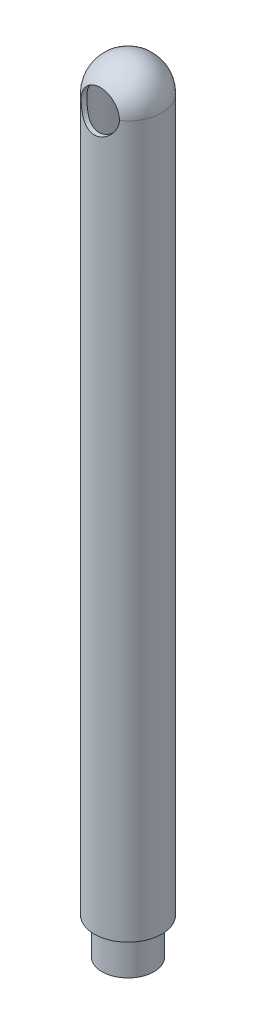
ISO-10303-21;
HEADER;
FILE_DESCRIPTION(('STEP AP214'),'2;1');
FILE_NAME('part.step','',(''),(''),'','','');
FILE_SCHEMA(('AUTOMOTIVE_DESIGN { 1 0 10303 214 1 1 1 1 }'));
ENDSEC;
DATA;
#1=APPLICATION_CONTEXT('core data for automotive mechanical design processes');
#2=APPLICATION_PROTOCOL_DEFINITION('international standard','automotive_design',2000,#1);
#3=PRODUCT_CONTEXT('',#1,'mechanical');
#4=PRODUCT('Part','Part','',(#3));
#5=PRODUCT_RELATED_PRODUCT_CATEGORY('part','',(#4));
#6=PRODUCT_DEFINITION_FORMATION('','',#4);
#7=PRODUCT_DEFINITION_CONTEXT('part definition',#1,'design');
#8=PRODUCT_DEFINITION('design','',#6,#7);
#9=PRODUCT_DEFINITION_SHAPE('','',#8);
#10=(LENGTH_UNIT() NAMED_UNIT(*) SI_UNIT(.MILLI.,.METRE.));
#11=(NAMED_UNIT(*) PLANE_ANGLE_UNIT() SI_UNIT($,.RADIAN.));
#12=(NAMED_UNIT(*) SI_UNIT($,.STERADIAN.) SOLID_ANGLE_UNIT());
#13=UNCERTAINTY_MEASURE_WITH_UNIT(LENGTH_MEASURE(1.E-05),#10,'distance_accuracy_value','');
#14=(GEOMETRIC_REPRESENTATION_CONTEXT(3) GLOBAL_UNCERTAINTY_ASSIGNED_CONTEXT((#13)) GLOBAL_UNIT_ASSIGNED_CONTEXT((#10,
#11,#12)) REPRESENTATION_CONTEXT('',''));
#15=CARTESIAN_POINT('',(0.,0.,0.));
#16=DIRECTION('',(0.,0.,1.));
#17=DIRECTION('',(1.,0.,0.));
#18=AXIS2_PLACEMENT_3D('',#15,#16,#17);
#19=CARTESIAN_POINT('',(0.,821.,0.));
#20=DIRECTION('',(0.,-1.,0.));
#21=DIRECTION('',(1.,0.,0.));
#22=AXIS2_PLACEMENT_3D('',#19,#20,#21);
#23=SPHERICAL_SURFACE('',#22,32.);
#24=CARTESIAN_POINT('',(0.,821.,0.));
#25=DIRECTION('',(0.,-1.,0.));
#26=DIRECTION('',(0.,0.,-1.));
#27=AXIS2_PLACEMENT_3D('',#24,#25,#26);
#28=CIRCLE('',#27,32.);
#29=CARTESIAN_POINT('',(21.,821.,-24.1453929352993));
#30=VERTEX_POINT('',#29);
#31=CARTESIAN_POINT('',(21.,821.,24.1453929352993));
#32=VERTEX_POINT('',#31);
#33=EDGE_CURVE('E79',#30,#32,#28,.T.);
#34=ORIENTED_EDGE('',*,*,#33,.T.);
#35=CARTESIAN_POINT('',(0.,821.,24.1453929352993));
#36=DIRECTION('',(0.,0.,-1.));
#37=DIRECTION('',(-1.,0.,0.));
#38=AXIS2_PLACEMENT_3D('',#35,#36,#37);
#39=CIRCLE('',#38,21.);
#40=CARTESIAN_POINT('',(-21.,821.,24.1453929352993));
#41=VERTEX_POINT('',#40);
#42=EDGE_CURVE('E54',#32,#41,#39,.F.);
#43=ORIENTED_EDGE('',*,*,#42,.T.);
#44=CARTESIAN_POINT('',(-21.,821.,-24.1453929352993));
#45=VERTEX_POINT('',#44);
#46=EDGE_CURVE('E113',#41,#45,#28,.T.);
#47=ORIENTED_EDGE('',*,*,#46,.T.);
#48=CARTESIAN_POINT('',(0.,821.,-24.1453929352993));
#49=DIRECTION('',(0.,0.,1.));
#50=DIRECTION('',(1.,0.,0.));
#51=AXIS2_PLACEMENT_3D('',#48,#49,#50);
#52=CIRCLE('',#51,21.);
#53=EDGE_CURVE('E47',#45,#30,#52,.F.);
#54=ORIENTED_EDGE('',*,*,#53,.T.);
#55=EDGE_LOOP('',(#34,#43,#47,#54));
#56=FACE_BOUND('',#55,.T.);
#57=ADVANCED_FACE('F34',(#56),#23,.F.);
#58=CARTESIAN_POINT('',(0.,0.,0.));
#59=DIRECTION('',(0.,-1.,0.));
#60=DIRECTION('',(0.,0.,-1.));
#61=AXIS2_PLACEMENT_3D('',#58,#59,#60);
#62=CYLINDRICAL_SURFACE('',#61,32.);
#63=ORIENTED_EDGE('',*,*,#33,.F.);
#64=CARTESIAN_POINT('',(21.,821.,-24.1453929352993));
#65=CARTESIAN_POINT('',(21.0000088316979,820.740691037745,-24.1453747677393));
#66=CARTESIAN_POINT('',(20.9951972765071,820.481389489406,-24.1495697541191));
#67=CARTESIAN_POINT('',(20.9760002226579,819.963431901864,-24.1662514695807));
#68=CARTESIAN_POINT('',(20.9616156272982,819.704775804069,-24.1787374163389));
#69=CARTESIAN_POINT('',(20.9233631858055,819.189012695056,-24.2118458608544));
#70=CARTESIAN_POINT('',(20.8995071977962,818.931904153378,-24.2324581842149));
#71=CARTESIAN_POINT('',(20.8424448952335,818.41950084767,-24.2815545901595));
#72=CARTESIAN_POINT('',(20.8092384326426,818.164206112423,-24.3100387973717));
#73=CARTESIAN_POINT('',(20.6965472767031,817.406718763127,-24.4062037181729));
#74=CARTESIAN_POINT('',(20.603607348189,816.907831391839,-24.484935518309));
#75=CARTESIAN_POINT('',(20.383230871151,815.922703361117,-24.6686919441093));
#76=CARTESIAN_POINT('',(20.255784861515,815.436466210343,-24.7737237803018));
#77=CARTESIAN_POINT('',(19.9689375471104,814.481658382307,-25.0055059082618));
#78=CARTESIAN_POINT('',(19.8096982360571,814.013011902402,-25.1321456458305));
#79=CARTESIAN_POINT('',(19.4606530644217,813.092710379754,-25.4033815484109));
#80=CARTESIAN_POINT('',(19.2708486384692,812.641054540749,-25.5479768705714));
#81=CARTESIAN_POINT('',(18.8617380553961,811.754802944317,-25.8514962040515));
#82=CARTESIAN_POINT('',(18.6423570553214,811.320254202796,-26.0104562170485));
#83=CARTESIAN_POINT('',(18.1758299736148,810.470314733638,-26.3385753299218));
#84=CARTESIAN_POINT('',(17.9286803038417,810.054926491637,-26.5077357465364));
#85=CARTESIAN_POINT('',(17.3689891030261,809.183709731309,-26.8783737219659));
#86=CARTESIAN_POINT('',(17.052189822581,808.731064150408,-27.0809139321511));
#87=CARTESIAN_POINT('',(16.3848883436248,807.853157212833,-27.4897906969876));
#88=CARTESIAN_POINT('',(16.0343839514127,807.427897641593,-27.6961274980328));
#89=CARTESIAN_POINT('',(15.3007230709074,806.605853630457,-28.1080933809534));
#90=CARTESIAN_POINT('',(14.9175553028036,806.209079115301,-28.3137221926224));
#91=CARTESIAN_POINT('',(14.1197500789186,805.445659373694,-28.7199073269651));
#92=CARTESIAN_POINT('',(13.705110563228,805.079016122691,-28.9204633164618));
#93=CARTESIAN_POINT('',(12.7858306114702,804.329022586695,-29.3395942097164));
#94=CARTESIAN_POINT('',(12.2766837938949,803.950408540102,-29.5568100432697));
#95=CARTESIAN_POINT('',(11.2210442373302,803.237858130975,-29.9734912945481));
#96=CARTESIAN_POINT('',(10.674547176352,802.903926952195,-30.1729546518739));
#97=CARTESIAN_POINT('',(9.54741372521576,802.284766391966,-30.5483126085786));
#98=CARTESIAN_POINT('',(8.96680261086222,801.999501549402,-30.7242243487406));
#99=CARTESIAN_POINT('',(7.77493832830593,801.481488722635,-31.0472424497318));
#100=CARTESIAN_POINT('',(7.16369149881967,801.248729928985,-31.1943547386924));
#101=CARTESIAN_POINT('',(5.98400123885728,800.862132043321,-31.4406436445466));
#102=CARTESIAN_POINT('',(5.41820120544405,800.702441660689,-31.5433055403064));
#103=CARTESIAN_POINT('',(4.27079361705985,800.430415310377,-31.7190322235755));
#104=CARTESIAN_POINT('',(3.68918710819908,800.31807621696,-31.7920989646969));
#105=CARTESIAN_POINT('',(2.51606531754383,800.142847689961,-31.9063691696717));
#106=CARTESIAN_POINT('',(1.92456061227867,800.079908536209,-31.9476046704178));
#107=CARTESIAN_POINT('',(0.736995310789576,800.004508202843,-31.9970285689199));
#108=CARTESIAN_POINT('',(0.140935336372701,799.992040252855,-32.0052213991287));
#109=CARTESIAN_POINT('',(-0.961567175425794,800.01588625848,-31.9895769030265));
#110=CARTESIAN_POINT('',(-1.46824295696806,800.045267102885,-31.9702917121716));
#111=CARTESIAN_POINT('',(-2.47664429448449,800.140406828278,-31.9080134046263));
#112=CARTESIAN_POINT('',(-2.97837046012767,800.206161170547,-31.8650232458663));
#113=CARTESIAN_POINT('',(-3.97337860741311,800.373153357857,-31.756303248893));
#114=CARTESIAN_POINT('',(-4.46666012877832,800.474393130621,-31.6905721752968));
#115=CARTESIAN_POINT('',(-5.4415741460432,800.711064196975,-31.5377987791912));
#116=CARTESIAN_POINT('',(-5.92320613966885,800.84649696194,-31.4507555395927));
#117=CARTESIAN_POINT('',(-6.87094197136686,801.149631034804,-31.257376111375));
#118=CARTESIAN_POINT('',(-7.33707852742383,801.317258516305,-31.1510840937894));
#119=CARTESIAN_POINT('',(-8.25265227363691,801.683250544071,-30.9211342776345));
#120=CARTESIAN_POINT('',(-8.70208973558278,801.881614589803,-30.7974767618578));
#121=CARTESIAN_POINT('',(-9.58238329813768,802.307301771889,-30.5350435362887));
#122=CARTESIAN_POINT('',(-10.013240417395,802.534623317969,-30.3962686567649));
#123=CARTESIAN_POINT('',(-10.8549575374055,803.016531513341,-30.1059487747669));
#124=CARTESIAN_POINT('',(-11.2658152203512,803.271121311959,-29.9544022976782));
#125=CARTESIAN_POINT('',(-12.1182215278016,803.840618256934,-29.6206757017217));
#126=CARTESIAN_POINT('',(-12.5568486936885,804.159066537129,-29.4370706534333));
#127=CARTESIAN_POINT('',(-13.405734382334,804.826629289831,-29.0603162969956));
#128=CARTESIAN_POINT('',(-13.8159908807211,805.175745946634,-28.8671663094557));
#129=CARTESIAN_POINT('',(-14.6077999759704,805.903579506988,-28.4746867647341));
#130=CARTESIAN_POINT('',(-14.9892960107424,806.282351898377,-28.2753460659012));
#131=CARTESIAN_POINT('',(-15.7217174653375,807.06745349012,-27.874753233038));
#132=CARTESIAN_POINT('',(-16.0726409813813,807.473784403772,-27.6735009808377));
#133=CARTESIAN_POINT('',(-16.7933004623472,808.375949408215,-27.2431023121571));
#134=CARTESIAN_POINT('',(-17.1579263128651,808.876052917794,-27.014313558808));
#135=CARTESIAN_POINT('',(-17.843462775851,809.909667815585,-26.5664923504611));
#136=CARTESIAN_POINT('',(-18.1643662674575,810.443184625065,-26.3474614885868));
#137=CARTESIAN_POINT('',(-18.7588133044343,811.53985215885,-25.9275689968921));
#138=CARTESIAN_POINT('',(-19.0325378015737,812.102878345072,-25.7266394243189));
#139=CARTESIAN_POINT('',(-19.5310833971079,813.258398140622,-25.350235188121));
#140=CARTESIAN_POINT('',(-19.755915286797,813.850885211971,-25.1747549103287));
#141=CARTESIAN_POINT('',(-20.1230748987986,814.970519282704,-24.881888996788));
#142=CARTESIAN_POINT('',(-20.2727352808587,815.494016151922,-24.7597318742219));
#143=CARTESIAN_POINT('',(-20.5318473985312,816.556811381714,-24.5452986216119));
#144=CARTESIAN_POINT('',(-20.6413188295875,817.096101861999,-24.4530078575638));
#145=CARTESIAN_POINT('',(-20.7742853301892,817.916631418739,-24.3399343722897));
#146=CARTESIAN_POINT('',(-20.8135326807269,818.193678818179,-24.3063534449985));
#147=CARTESIAN_POINT('',(-20.8810059901811,818.750092842199,-24.2484140350027));
#148=CARTESIAN_POINT('',(-20.9092322123994,819.029459411211,-24.2240553319738));
#149=CARTESIAN_POINT('',(-20.954519885941,819.590265390923,-24.1848928121051));
#150=CARTESIAN_POINT('',(-20.9715613336249,819.87170761005,-24.1701061151591));
#151=CARTESIAN_POINT('',(-20.9943083173097,820.43542958441,-24.150342811806));
#152=CARTESIAN_POINT('',(-21.0000123483377,820.717709445855,-24.1453675078022));
#153=CARTESIAN_POINT('',(-21.,821.,-24.1453929352993));
#154=B_SPLINE_CURVE_WITH_KNOTS('',3,(#64,#65,#66,#67,#68,#69,#70,#71,#72,#73,#74,#75,#76,#77,
#78,#79,#80,#81,#82,#83,#84,#85,#86,#87,#88,#89,#90,#91,#92,#93,#94,#95,#96,#97,#98,#99,#100,
#101,#102,#103,#104,#105,#106,#107,#108,#109,#110,#111,#112,#113,#114,#115,#116,#117,#118,#119,
#120,#121,#122,#123,#124,#125,#126,#127,#128,#129,#130,#131,#132,#133,#134,#135,#136,#137,#138,
#139,#140,#141,#142,#143,#144,#145,#146,#147,#148,#149,#150,#151,#152,#153),.UNSPECIFIED.,.F.,
.F.,(4,2,2,2,2,2,2,2,2,2,2,2,2,2,2,2,2,2,2,2,2,2,2,2,2,2,2,2,2,2,2,2,2,2,2,2,2,2,2,2,2,2,2,2,4),
(0.,0.777835610910544,1.55559783675146,2.33238936445954,3.10919319107683,4.64751016167806,
6.18624934637903,7.71733970660556,9.24835822323328,10.7833263329427,12.3184930128536,
14.0821507442629,15.8459233413221,17.6103075177792,19.374807277617,21.3840459526791,
23.3935175220248,25.401518561387,27.4091058345459,29.1968321670981,30.9844404704112,
32.7702472619219,34.5558144914494,36.0776528197473,37.5993012944336,39.1210324444981,
40.6428290880737,42.1611768561701,43.6794999012305,45.197739599682,46.7161548355704,
48.4313200899513,50.1466076028915,51.8651849685514,53.5838692752517,55.5610746202655,
57.5386015997574,59.5083664463177,61.4776960954902,63.1495324713512,64.8205484313183,
65.6657008846277,66.5108331454722,67.3574728112179,68.2042248557166),.UNSPECIFIED.);
#155=EDGE_CURVE('E123',#30,#45,#154,.T.);
#156=ORIENTED_EDGE('',*,*,#155,.T.);
#157=ORIENTED_EDGE('',*,*,#46,.F.);
#158=CARTESIAN_POINT('',(-21.,821.,24.1453929352993));
#159=CARTESIAN_POINT('',(-21.0000088316979,820.740691037745,24.1453747677393));
#160=CARTESIAN_POINT('',(-20.9951972765071,820.481389489406,24.1495697541191));
#161=CARTESIAN_POINT('',(-20.9760002226579,819.963431901864,24.1662514695807));
#162=CARTESIAN_POINT('',(-20.9616156272982,819.704775804069,24.1787374163389));
#163=CARTESIAN_POINT('',(-20.9233631858055,819.189012695056,24.2118458608544));
#164=CARTESIAN_POINT('',(-20.8995071977962,818.931904153378,24.2324581842149));
#165=CARTESIAN_POINT('',(-20.8424448952335,818.41950084767,24.2815545901595));
#166=CARTESIAN_POINT('',(-20.8092384326426,818.164206112423,24.3100387973717));
#167=CARTESIAN_POINT('',(-20.6965472767031,817.406718763127,24.4062037181729));
#168=CARTESIAN_POINT('',(-20.603607348189,816.907831391839,24.484935518309));
#169=CARTESIAN_POINT('',(-20.383230871151,815.922703361117,24.6686919441093));
#170=CARTESIAN_POINT('',(-20.255784861515,815.436466210343,24.7737237803018));
#171=CARTESIAN_POINT('',(-19.9689375471104,814.481658382307,25.0055059082618));
#172=CARTESIAN_POINT('',(-19.8096982360572,814.013011902402,25.1321456458305));
#173=CARTESIAN_POINT('',(-19.4606530644217,813.092710379754,25.4033815484109));
#174=CARTESIAN_POINT('',(-19.2708486384692,812.641054540749,25.5479768705714));
#175=CARTESIAN_POINT('',(-18.8617380553961,811.754802944317,25.8514962040515));
#176=CARTESIAN_POINT('',(-18.6423570553214,811.320254202796,26.0104562170485));
#177=CARTESIAN_POINT('',(-18.1758299736149,810.470314733638,26.3385753299218));
#178=CARTESIAN_POINT('',(-17.9286803038417,810.054926491637,26.5077357465364));
#179=CARTESIAN_POINT('',(-17.3689891030261,809.183709731309,26.8783737219659));
#180=CARTESIAN_POINT('',(-17.052189822581,808.731064150408,27.0809139321511));
#181=CARTESIAN_POINT('',(-16.3848883436248,807.853157212833,27.4897906969876));
#182=CARTESIAN_POINT('',(-16.0343839514128,807.427897641593,27.6961274980328));
#183=CARTESIAN_POINT('',(-15.3007230709074,806.605853630457,28.1080933809534));
#184=CARTESIAN_POINT('',(-14.9175553028036,806.209079115301,28.3137221926224));
#185=CARTESIAN_POINT('',(-14.1197500789186,805.445659373694,28.7199073269651));
#186=CARTESIAN_POINT('',(-13.705110563228,805.079016122691,28.9204633164618));
#187=CARTESIAN_POINT('',(-12.7858306114702,804.329022586695,29.3395942097164));
#188=CARTESIAN_POINT('',(-12.2766837938948,803.950408540102,29.5568100432697));
#189=CARTESIAN_POINT('',(-11.2210442373302,803.237858130975,29.9734912945481));
#190=CARTESIAN_POINT('',(-10.674547176352,802.903926952195,30.1729546518739));
#191=CARTESIAN_POINT('',(-9.54741372521578,802.284766391966,30.5483126085786));
#192=CARTESIAN_POINT('',(-8.96680261086224,801.999501549402,30.7242243487406));
#193=CARTESIAN_POINT('',(-7.77493832830595,801.481488722635,31.0472424497318));
#194=CARTESIAN_POINT('',(-7.16369149881969,801.248729928985,31.1943547386924));
#195=CARTESIAN_POINT('',(-5.9840012388573,800.862132043321,31.4406436445466));
#196=CARTESIAN_POINT('',(-5.41820120544407,800.702441660689,31.5433055403064));
#197=CARTESIAN_POINT('',(-4.27079361705987,800.430415310377,31.7190322235755));
#198=CARTESIAN_POINT('',(-3.6891871081991,800.31807621696,31.7920989646969));
#199=CARTESIAN_POINT('',(-2.51606531754385,800.142847689961,31.9063691696717));
#200=CARTESIAN_POINT('',(-1.92456061227869,800.079908536209,31.9476046704178));
#201=CARTESIAN_POINT('',(-0.736995310789591,800.004508202843,31.9970285689199));
#202=CARTESIAN_POINT('',(-0.140935336372716,799.992040252855,32.0052213991287));
#203=CARTESIAN_POINT('',(0.961567175425779,800.01588625848,31.9895769030265));
#204=CARTESIAN_POINT('',(1.46824295696805,800.045267102885,31.9702917121716));
#205=CARTESIAN_POINT('',(2.47664429448447,800.140406828278,31.9080134046263));
#206=CARTESIAN_POINT('',(2.97837046012766,800.206161170547,31.8650232458663));
#207=CARTESIAN_POINT('',(3.97337860741309,800.373153357857,31.756303248893));
#208=CARTESIAN_POINT('',(4.4666601287783,800.474393130621,31.6905721752968));
#209=CARTESIAN_POINT('',(5.44157414604318,800.711064196975,31.5377987791912));
#210=CARTESIAN_POINT('',(5.92320613966883,800.84649696194,31.4507555395927));
#211=CARTESIAN_POINT('',(6.87094197136685,801.149631034804,31.257376111375));
#212=CARTESIAN_POINT('',(7.33707852742382,801.317258516305,31.1510840937894));
#213=CARTESIAN_POINT('',(8.2526522736369,801.683250544071,30.9211342776345));
#214=CARTESIAN_POINT('',(8.70208973558276,801.881614589803,30.7974767618578));
#215=CARTESIAN_POINT('',(9.58238329813766,802.307301771889,30.5350435362887));
#216=CARTESIAN_POINT('',(10.013240417395,802.534623317969,30.3962686567649));
#217=CARTESIAN_POINT('',(10.8549575374055,803.016531513341,30.1059487747669));
#218=CARTESIAN_POINT('',(11.2658152203511,803.271121311959,29.9544022976783));
#219=CARTESIAN_POINT('',(12.1182215278016,803.840618256934,29.6206757017217));
#220=CARTESIAN_POINT('',(12.5568486936884,804.159066537129,29.4370706534333));
#221=CARTESIAN_POINT('',(13.405734382334,804.826629289831,29.0603162969957));
#222=CARTESIAN_POINT('',(13.815990880721,805.175745946633,28.8671663094557));
#223=CARTESIAN_POINT('',(14.6077999759704,805.903579506988,28.4746867647341));
#224=CARTESIAN_POINT('',(14.9892960107424,806.282351898377,28.2753460659013));
#225=CARTESIAN_POINT('',(15.7217174653375,807.06745349012,27.874753233038));
#226=CARTESIAN_POINT('',(16.0726409813813,807.473784403772,27.6735009808377));
#227=CARTESIAN_POINT('',(16.7933004623472,808.375949408215,27.2431023121571));
#228=CARTESIAN_POINT('',(17.1579263128651,808.876052917794,27.014313558808));
#229=CARTESIAN_POINT('',(17.8434627758509,809.909667815585,26.5664923504611));
#230=CARTESIAN_POINT('',(18.1643662674574,810.443184625065,26.3474614885868));
#231=CARTESIAN_POINT('',(18.7588133044342,811.53985215885,25.9275689968922));
#232=CARTESIAN_POINT('',(19.0325378015737,812.102878345072,25.7266394243189));
#233=CARTESIAN_POINT('',(19.5310833971079,813.258398140622,25.350235188121));
#234=CARTESIAN_POINT('',(19.755915286797,813.850885211971,25.1747549103287));
#235=CARTESIAN_POINT('',(20.1230748987986,814.970519282704,24.881888996788));
#236=CARTESIAN_POINT('',(20.2727352808586,815.494016151921,24.7597318742219));
#237=CARTESIAN_POINT('',(20.5318473985312,816.556811381714,24.5452986216119));
#238=CARTESIAN_POINT('',(20.6413188295874,817.096101861999,24.4530078575638));
#239=CARTESIAN_POINT('',(20.7742853301892,817.916631418739,24.3399343722897));
#240=CARTESIAN_POINT('',(20.8135326807268,818.193678818179,24.3063534449985));
#241=CARTESIAN_POINT('',(20.881005990181,818.750092842199,24.2484140350028));
#242=CARTESIAN_POINT('',(20.9092322123993,819.029459411211,24.2240553319738));
#243=CARTESIAN_POINT('',(20.9545198859409,819.590265390923,24.1848928121052));
#244=CARTESIAN_POINT('',(20.9715613336249,819.87170761005,24.1701061151592));
#245=CARTESIAN_POINT('',(20.9943083173097,820.43542958441,24.150342811806));
#246=CARTESIAN_POINT('',(21.0000123483377,820.717709445855,24.1453675078023));
#247=CARTESIAN_POINT('',(21.,821.,24.1453929352993));
#248=B_SPLINE_CURVE_WITH_KNOTS('',3,(#158,#159,#160,#161,#162,#163,#164,#165,#166,#167,#168,
#169,#170,#171,#172,#173,#174,#175,#176,#177,#178,#179,#180,#181,#182,#183,#184,#185,#186,#187,
#188,#189,#190,#191,#192,#193,#194,#195,#196,#197,#198,#199,#200,#201,#202,#203,#204,#205,#206,
#207,#208,#209,#210,#211,#212,#213,#214,#215,#216,#217,#218,#219,#220,#221,#222,#223,#224,#225,
#226,#227,#228,#229,#230,#231,#232,#233,#234,#235,#236,#237,#238,#239,#240,#241,#242,#243,#244,
#245,#246,#247),.UNSPECIFIED.,.F.,.F.,(4,2,2,2,2,2,2,2,2,2,2,2,2,2,2,2,2,2,2,2,2,2,2,2,2,2,2,2,
2,2,2,2,2,2,2,2,2,2,2,2,2,2,2,2,4),(0.,0.777835610910544,1.55559783675146,2.33238936445954,
3.10919319107683,4.64751016167806,6.18624934637903,7.71733970660556,9.24835822323328,
10.7833263329427,12.3184930128536,14.0821507442629,15.8459233413221,17.6103075177792,
19.374807277617,21.3840459526791,23.3935175220248,25.401518561387,27.4091058345459,
29.1968321670981,30.9844404704112,32.7702472619219,34.5558144914494,36.0776528197473,
37.5993012944336,39.1210324444981,40.6428290880737,42.1611768561701,43.6794999012305,
45.197739599682,46.7161548355704,48.4313200899512,50.1466076028914,51.8651849685515,
53.5838692752517,55.5610746202653,57.5386015997573,59.5083664463177,61.4776960954902,
63.149532471351,64.8205484313182,65.6657008846276,66.5108331454719,67.3574728112178,
68.2042248557165),.UNSPECIFIED.);
#249=EDGE_CURVE('E122',#41,#32,#248,.T.);
#250=ORIENTED_EDGE('',*,*,#249,.T.);
#251=EDGE_LOOP('',(#63,#156,#157,#250));
#252=FACE_BOUND('',#251,.T.);
#253=CARTESIAN_POINT('',(0.,45.,0.));
#254=DIRECTION('',(0.,-1.,0.));
#255=DIRECTION('',(0.,0.,-1.));
#256=AXIS2_PLACEMENT_3D('',#253,#254,#255);
#257=CIRCLE('',#256,32.);
#258=CARTESIAN_POINT('',(0.,45.,-32.));
#259=VERTEX_POINT('',#258);
#260=EDGE_CURVE('E110',#259,#259,#257,.T.);
#261=ORIENTED_EDGE('',*,*,#260,.T.);
#262=EDGE_LOOP('',(#261));
#263=FACE_BOUND('',#262,.T.);
#264=ADVANCED_FACE('F120',(#252,#263),#62,.F.);
#265=CARTESIAN_POINT('',(0.,45.,0.));
#266=DIRECTION('',(0.,-1.,0.));
#267=DIRECTION('',(0.,0.,-1.));
#268=AXIS2_PLACEMENT_3D('',#265,#266,#267);
#269=PLANE('',#268);
#270=ORIENTED_EDGE('',*,*,#260,.F.);
#271=EDGE_LOOP('',(#270));
#272=FACE_BOUND('',#271,.T.);
#273=CARTESIAN_POINT('',(0.,45.,0.));
#274=DIRECTION('',(0.,-1.,0.));
#275=DIRECTION('',(0.,0.,-1.));
#276=AXIS2_PLACEMENT_3D('',#273,#274,#275);
#277=CIRCLE('',#276,23.5);
#278=CARTESIAN_POINT('',(0.,45.,-23.5));
#279=VERTEX_POINT('',#278);
#280=EDGE_CURVE('E107',#279,#279,#277,.T.);
#281=ORIENTED_EDGE('',*,*,#280,.T.);
#282=EDGE_LOOP('',(#281));
#283=FACE_BOUND('',#282,.T.);
#284=ADVANCED_FACE('F158',(#272,#283),#269,.F.);
#285=CARTESIAN_POINT('',(0.,0.,0.));
#286=DIRECTION('',(0.,-1.,0.));
#287=DIRECTION('',(0.,0.,-1.));
#288=AXIS2_PLACEMENT_3D('',#285,#286,#287);
#289=CYLINDRICAL_SURFACE('',#288,23.5);
#290=ORIENTED_EDGE('',*,*,#280,.F.);
#291=EDGE_LOOP('',(#290));
#292=FACE_BOUND('',#291,.T.);
#293=CARTESIAN_POINT('',(0.,0.,0.));
#294=DIRECTION('',(0.,-1.,0.));
#295=DIRECTION('',(0.,0.,-1.));
#296=AXIS2_PLACEMENT_3D('',#293,#294,#295);
#297=CIRCLE('',#296,23.5);
#298=CARTESIAN_POINT('',(0.,0.,-23.5));
#299=VERTEX_POINT('',#298);
#300=EDGE_CURVE('E104',#299,#299,#297,.T.);
#301=ORIENTED_EDGE('',*,*,#300,.T.);
#302=EDGE_LOOP('',(#301));
#303=FACE_BOUND('',#302,.T.);
#304=ADVANCED_FACE('F162',(#292,#303),#289,.F.);
#305=CARTESIAN_POINT('',(0.,0.,0.));
#306=DIRECTION('',(0.,1.,0.));
#307=DIRECTION('',(0.,0.,1.));
#308=AXIS2_PLACEMENT_3D('',#305,#306,#307);
#309=PLANE('',#308);
#310=ORIENTED_EDGE('',*,*,#300,.F.);
#311=EDGE_LOOP('',(#310));
#312=FACE_BOUND('',#311,.T.);
#313=CARTESIAN_POINT('',(0.,0.,0.));
#314=DIRECTION('',(0.,-1.,0.));
#315=DIRECTION('',(0.,0.,-1.));
#316=AXIS2_PLACEMENT_3D('',#313,#314,#315);
#317=CIRCLE('',#316,28.5);
#318=CARTESIAN_POINT('',(0.,0.,-28.5));
#319=VERTEX_POINT('',#318);
#320=EDGE_CURVE('E101',#319,#319,#317,.T.);
#321=ORIENTED_EDGE('',*,*,#320,.T.);
#322=EDGE_LOOP('',(#321));
#323=FACE_BOUND('',#322,.T.);
#324=ADVANCED_FACE('F167',(#312,#323),#309,.F.);
#325=CARTESIAN_POINT('',(0.,0.,0.));
#326=DIRECTION('',(0.,-1.,0.));
#327=DIRECTION('',(0.,0.,-1.));
#328=AXIS2_PLACEMENT_3D('',#325,#326,#327);
#329=CYLINDRICAL_SURFACE('',#328,28.5);
#330=CARTESIAN_POINT('',(0.,40.,0.));
#331=DIRECTION('',(0.,-1.,0.));
#332=DIRECTION('',(0.,0.,-1.));
#333=AXIS2_PLACEMENT_3D('',#330,#331,#332);
#334=CIRCLE('',#333,28.5);
#335=CARTESIAN_POINT('',(0.,40.,-28.5));
#336=VERTEX_POINT('',#335);
#337=EDGE_CURVE('E94',#336,#336,#334,.T.);
#338=ORIENTED_EDGE('',*,*,#337,.T.);
#339=EDGE_LOOP('',(#338));
#340=FACE_BOUND('',#339,.T.);
#341=ORIENTED_EDGE('',*,*,#320,.F.);
#342=EDGE_LOOP('',(#341));
#343=FACE_BOUND('',#342,.T.);
#344=ADVANCED_FACE('F175',(#340,#343),#329,.T.);
#345=CARTESIAN_POINT('',(0.,40.,0.));
#346=DIRECTION('',(0.,-1.,0.));
#347=DIRECTION('',(0.,0.,-1.));
#348=AXIS2_PLACEMENT_3D('',#345,#346,#347);
#349=PLANE('',#348);
#350=CARTESIAN_POINT('',(0.,40.,0.));
#351=DIRECTION('',(0.,-1.,0.));
#352=DIRECTION('',(0.,0.,-1.));
#353=AXIS2_PLACEMENT_3D('',#350,#351,#352);
#354=CIRCLE('',#353,37.);
#355=CARTESIAN_POINT('',(0.,40.,-37.));
#356=VERTEX_POINT('',#355);
#357=EDGE_CURVE('E91',#356,#356,#354,.T.);
#358=ORIENTED_EDGE('',*,*,#357,.T.);
#359=EDGE_LOOP('',(#358));
#360=FACE_BOUND('',#359,.T.);
#361=ORIENTED_EDGE('',*,*,#337,.F.);
#362=EDGE_LOOP('',(#361));
#363=FACE_BOUND('',#362,.T.);
#364=ADVANCED_FACE('F179',(#360,#363),#349,.T.);
#365=CARTESIAN_POINT('',(0.,0.,0.));
#366=DIRECTION('',(0.,-1.,0.));
#367=DIRECTION('',(0.,0.,-1.));
#368=AXIS2_PLACEMENT_3D('',#365,#366,#367);
#369=CYLINDRICAL_SURFACE('',#368,37.);
#370=CARTESIAN_POINT('',(21.,821.,-30.4630924234556));
#371=CARTESIAN_POINT('',(21.0000073262817,820.731189787036,-30.4630792801586));
#372=CARTESIAN_POINT('',(20.9948387992314,820.462385228528,-30.4666501375205));
#373=CARTESIAN_POINT('',(20.9742055145974,819.925374282696,-30.4808626862339));
#374=CARTESIAN_POINT('',(20.9587413689901,819.657167860769,-30.4915039573165));
#375=CARTESIAN_POINT('',(20.9175892458381,819.122128137417,-30.5197485645538));
#376=CARTESIAN_POINT('',(20.891909689798,818.855293887867,-30.5373461658891));
#377=CARTESIAN_POINT('',(20.8304403165183,818.323346350503,-30.5793087651143));
#378=CARTESIAN_POINT('',(20.7946504035362,818.058233079011,-30.6036738270903));
#379=CARTESIAN_POINT('',(20.6728984187858,817.270076191436,-30.6861697671083));
#380=CARTESIAN_POINT('',(20.57224222865,816.750206175432,-30.7539195489469));
#381=CARTESIAN_POINT('',(20.3330008256143,815.722932287711,-30.9126118163972));
#382=CARTESIAN_POINT('',(20.1944092372821,815.215530527046,-31.00355820026));
#383=CARTESIAN_POINT('',(19.8814897424874,814.217754555845,-31.2051415253092));
#384=CARTESIAN_POINT('',(19.7072764882901,813.727331476066,-31.3157151471102));
#385=CARTESIAN_POINT('',(19.3246080672965,812.764219599621,-31.5532914305637));
#386=CARTESIAN_POINT('',(19.1161537036553,812.291530387311,-31.6802937068529));
#387=CARTESIAN_POINT('',(18.6662684755912,811.364844691443,-31.9474406108234));
#388=CARTESIAN_POINT('',(18.4247763649775,810.910885012706,-32.0876094921856));
#389=CARTESIAN_POINT('',(17.9106649403664,810.024079854279,-32.3773864757737));
#390=CARTESIAN_POINT('',(17.6380423976134,809.591236571377,-32.5269955563877));
#391=CARTESIAN_POINT('',(17.0322001145425,808.702703312134,-32.8486535677944));
#392=CARTESIAN_POINT('',(16.6956168924399,808.249551600986,-33.0213869364217));
#393=CARTESIAN_POINT('',(15.9877358756512,807.372456590684,-33.3698658898318));
#394=CARTESIAN_POINT('',(15.6164362296818,806.948514851274,-33.5456116348435));
#395=CARTESIAN_POINT('',(14.8406016882713,806.13144294136,-33.8959841445135));
#396=CARTESIAN_POINT('',(14.4360571207653,805.738321803069,-34.0706105674806));
#397=CARTESIAN_POINT('',(13.5954028480296,804.98489364322,-34.4146962655983));
#398=CARTESIAN_POINT('',(13.1592917932624,804.624588026088,-34.5841553193917));
#399=CARTESIAN_POINT('',(12.2149662427592,803.906772510843,-34.9295054327883));
#400=CARTESIAN_POINT('',(11.7038230929028,803.552677050078,-35.1045152955826));
#401=CARTESIAN_POINT('',(10.648364538898,802.8892056197,-35.4389444159262));
#402=CARTESIAN_POINT('',(10.1040465162942,802.579833186542,-35.5983624402358));
#403=CARTESIAN_POINT('',(8.98579377545325,802.009232611914,-35.8969380893811));
#404=CARTESIAN_POINT('',(8.41187673544055,801.747976149483,-36.0361076222407));
#405=CARTESIAN_POINT('',(7.23818631111371,801.276704394683,-36.2900669392295));
#406=CARTESIAN_POINT('',(6.63841665456116,801.066681743658,-36.4048602241858));
#407=CARTESIAN_POINT('',(5.47135075111765,800.716945617311,-36.5975811223989));
#408=CARTESIAN_POINT('',(4.90580182372339,800.572689577531,-36.6778548446089));
#409=CARTESIAN_POINT('',(3.76169678725682,800.331392524959,-36.8127871980505));
#410=CARTESIAN_POINT('',(3.18314137290289,800.234348996632,-36.8674471940032));
#411=CARTESIAN_POINT('',(2.01841377857139,800.088992978192,-36.9495144350707));
#412=CARTESIAN_POINT('',(1.43224700389425,800.040647636648,-36.9769400521156));
#413=CARTESIAN_POINT('',(0.257303114232649,799.993349213026,-37.0037697337287));
#414=CARTESIAN_POINT('',(-0.33147377046627,799.994391856963,-37.0031762230435));
#415=CARTESIAN_POINT('',(-1.4406118576899,800.042958368936,-36.9756312419025));
#416=CARTESIAN_POINT('',(-1.96128382139071,800.085288278257,-36.9516251211814));
#417=CARTESIAN_POINT('',(-2.99657110881471,800.208361192122,-36.8821048028966));
#418=CARTESIAN_POINT('',(-3.51118698314664,800.289100676451,-36.8365925763571));
#419=CARTESIAN_POINT('',(-4.53086126258374,800.488023877406,-36.7251193400592));
#420=CARTESIAN_POINT('',(-5.0359194526319,800.606208435524,-36.6591578707523));
#421=CARTESIAN_POINT('',(-6.03328875863965,800.878700183883,-36.5082708771462));
#422=CARTESIAN_POINT('',(-6.52559936712539,801.033008809755,-36.4233445991601));
#423=CARTESIAN_POINT('',(-7.49908773107969,801.377748025534,-36.2355032633964));
#424=CARTESIAN_POINT('',(-7.98012218348478,801.568496575861,-36.1324305390903));
#425=CARTESIAN_POINT('',(-8.92386468263602,801.98341858198,-35.9109954485033));
#426=CARTESIAN_POINT('',(-9.38657284119492,802.207591833801,-35.7926331755261));
#427=CARTESIAN_POINT('',(-10.2916859365514,802.687608860885,-35.542954937893));
#428=CARTESIAN_POINT('',(-10.7340875849369,802.943457741032,-35.4116368859618));
#429=CARTESIAN_POINT('',(-11.5968272743116,803.48506152568,-35.1385597229849));
#430=CARTESIAN_POINT('',(-12.0171631762837,803.770819321493,-34.9967996028916));
#431=CARTESIAN_POINT('',(-12.8800999131458,804.404197106812,-34.6891289968841));
#432=CARTESIAN_POINT('',(-13.3199190624549,804.75516103625,-34.5222921909059));
#433=CARTESIAN_POINT('',(-14.1687439274885,805.489943167464,-34.1826814793623));
#434=CARTESIAN_POINT('',(-14.5777475745785,805.873763571196,-34.0099071763464));
#435=CARTESIAN_POINT('',(-15.3638750751634,806.672896489012,-33.6620902331708));
#436=CARTESIAN_POINT('',(-15.7409568816732,807.088249212753,-33.4870449410201));
#437=CARTESIAN_POINT('',(-16.4610901684503,807.948290961332,-33.1389872520046));
#438=CARTESIAN_POINT('',(-16.8041404078301,808.392981054908,-32.9659749294703));
#439=CARTESIAN_POINT('',(-17.4865452454602,809.355175145803,-32.6095553743422));
#440=CARTESIAN_POINT('',(-17.8222207618945,809.875539564525,-32.4267984344192));
#441=CARTESIAN_POINT('',(-18.4480855648417,810.947471061146,-32.0748672727313));
#442=CARTESIAN_POINT('',(-18.738267953177,811.499042853834,-31.9056951127364));
#443=CARTESIAN_POINT('',(-19.2695439844222,812.629017273637,-31.5876606985385));
#444=CARTESIAN_POINT('',(-19.5107722206612,813.207340815678,-31.4387431395766));
#445=CARTESIAN_POINT('',(-19.9420266180381,814.388608918111,-31.1669807495764));
#446=CARTESIAN_POINT('',(-20.1320732349065,814.991543530929,-31.0441255064065));
#447=CARTESIAN_POINT('',(-20.4105276151239,816.03888707221,-30.8614542643029));
#448=CARTESIAN_POINT('',(-20.5124191216094,816.478373609711,-30.7936971856278));
#449=CARTESIAN_POINT('',(-20.68797974885,817.36520971563,-30.6760281519441));
#450=CARTESIAN_POINT('',(-20.7616572270046,817.812556914481,-30.6261109128123));
#451=CARTESIAN_POINT('',(-20.8802981419357,818.71500696322,-30.5453493737808));
#452=CARTESIAN_POINT('',(-20.9251225969,819.170136669308,-30.5145974131522));
#453=CARTESIAN_POINT('',(-20.9700148561181,819.855039339858,-30.4837458401841));
#454=CARTESIAN_POINT('',(-20.9812548926054,820.083805043495,-30.4760080073256));
#455=CARTESIAN_POINT('',(-20.9962483577068,820.541705643966,-30.4656790457651));
#456=CARTESIAN_POINT('',(-21.0000015200158,820.770840553642,-30.4630881001358));
#457=CARTESIAN_POINT('',(-21.,821.,-30.4630924234556));
#458=B_SPLINE_CURVE_WITH_KNOTS('',3,(#370,#371,#372,#373,#374,#375,#376,#377,#378,#379,#380,
#381,#382,#383,#384,#385,#386,#387,#388,#389,#390,#391,#392,#393,#394,#395,#396,#397,#398,#399,
#400,#401,#402,#403,#404,#405,#406,#407,#408,#409,#410,#411,#412,#413,#414,#415,#416,#417,#418,
#419,#420,#421,#422,#423,#424,#425,#426,#427,#428,#429,#430,#431,#432,#433,#434,#435,#436,#437,
#438,#439,#440,#441,#442,#443,#444,#445,#446,#447,#448,#449,#450,#451,#452,#453,#454,#455,#456,
#457),.UNSPECIFIED.,.F.,.F.,(4,2,2,2,2,2,2,2,2,2,2,2,2,2,2,2,2,2,2,2,2,2,2,2,2,2,2,2,2,2,2,2,2,
2,2,2,2,2,2,2,2,2,2,4),(0.,0.806347326984795,1.61264672857917,2.41828279619611,3.22392649323257,
4.82317636415631,6.42269517060277,8.01714457517713,9.61155658588832,11.2089654537949,
12.8065401509339,14.5756774360221,16.344909115749,18.1146573591832,19.8844813080262,
21.8198633708127,23.7553983894599,25.689790489569,27.6239045912399,29.3888702881486,
31.1537419354882,32.9174222147471,34.6809498672029,36.2479068613801,37.814720272547,
39.3815688966906,40.94847980057,42.5297450477563,44.1110006458082,45.6925114135556,
47.274175208318,49.0330439575468,50.7920306740508,52.5532993763998,54.3146322760143,
56.2491275598295,58.1839158903697,60.1133104598839,62.0419327610578,63.4093634765836,
64.776388825638,66.1499506600342,66.8373106918589,67.5246951723651),.UNSPECIFIED.);
#459=CARTESIAN_POINT('',(21.,821.,-30.4630924234557));
#460=VERTEX_POINT('',#459);
#461=CARTESIAN_POINT('',(-21.,821.,-30.4630924234557));
#462=VERTEX_POINT('',#461);
#463=EDGE_CURVE('E74',#460,#462,#458,.T.);
#464=ORIENTED_EDGE('',*,*,#463,.F.);
#465=CARTESIAN_POINT('',(0.,821.,0.));
#466=DIRECTION('',(0.,-1.,0.));
#467=DIRECTION('',(0.,0.,-1.));
#468=AXIS2_PLACEMENT_3D('',#465,#466,#467);
#469=CIRCLE('',#468,37.);
#470=CARTESIAN_POINT('',(21.,821.,30.4630924234557));
#471=VERTEX_POINT('',#470);
#472=EDGE_CURVE('E85',#460,#471,#469,.T.);
#473=ORIENTED_EDGE('',*,*,#472,.T.);
#474=CARTESIAN_POINT('',(-21.,821.,30.4630924234556));
#475=CARTESIAN_POINT('',(-21.0000073262817,820.731189787036,30.4630792801586));
#476=CARTESIAN_POINT('',(-20.9948387992314,820.462385228528,30.4666501375205));
#477=CARTESIAN_POINT('',(-20.9742055145974,819.925374282695,30.4808626862339));
#478=CARTESIAN_POINT('',(-20.9587413689901,819.657167860769,30.4915039573165));
#479=CARTESIAN_POINT('',(-20.9175892458381,819.122128137417,30.5197485645538));
#480=CARTESIAN_POINT('',(-20.891909689798,818.855293887867,30.5373461658891));
#481=CARTESIAN_POINT('',(-20.8304403165183,818.323346350503,30.5793087651143));
#482=CARTESIAN_POINT('',(-20.7946504035362,818.058233079011,30.6036738270903));
#483=CARTESIAN_POINT('',(-20.6728984187858,817.270076191436,30.6861697671083));
#484=CARTESIAN_POINT('',(-20.57224222865,816.750206175432,30.7539195489469));
#485=CARTESIAN_POINT('',(-20.3330008256143,815.722932287711,30.9126118163971));
#486=CARTESIAN_POINT('',(-20.1944092372821,815.215530527046,31.00355820026));
#487=CARTESIAN_POINT('',(-19.8814897424874,814.217754555845,31.2051415253092));
#488=CARTESIAN_POINT('',(-19.7072764882901,813.727331476066,31.3157151471102));
#489=CARTESIAN_POINT('',(-19.3246080672965,812.764219599621,31.5532914305637));
#490=CARTESIAN_POINT('',(-19.1161537036553,812.291530387311,31.6802937068528));
#491=CARTESIAN_POINT('',(-18.6662684755913,811.364844691443,31.9474406108234));
#492=CARTESIAN_POINT('',(-18.4247763649775,810.910885012706,32.0876094921856));
#493=CARTESIAN_POINT('',(-17.9106649403664,810.024079854279,32.3773864757737));
#494=CARTESIAN_POINT('',(-17.6380423976134,809.591236571377,32.5269955563877));
#495=CARTESIAN_POINT('',(-17.0322001145426,808.702703312134,32.8486535677944));
#496=CARTESIAN_POINT('',(-16.6956168924399,808.249551600986,33.0213869364217));
#497=CARTESIAN_POINT('',(-15.9877358756512,807.372456590684,33.3698658898318));
#498=CARTESIAN_POINT('',(-15.6164362296818,806.948514851274,33.5456116348435));
#499=CARTESIAN_POINT('',(-14.8406016882713,806.13144294136,33.8959841445135));
#500=CARTESIAN_POINT('',(-14.4360571207654,805.738321803069,34.0706105674806));
#501=CARTESIAN_POINT('',(-13.5954028480296,804.98489364322,34.4146962655983));
#502=CARTESIAN_POINT('',(-13.1592917932625,804.624588026088,34.5841553193917));
#503=CARTESIAN_POINT('',(-12.2149662427592,803.906772510843,34.9295054327883));
#504=CARTESIAN_POINT('',(-11.7038230929028,803.552677050078,35.1045152955826));
#505=CARTESIAN_POINT('',(-10.648364538898,802.8892056197,35.4389444159262));
#506=CARTESIAN_POINT('',(-10.1040465162942,802.579833186542,35.5983624402358));
#507=CARTESIAN_POINT('',(-8.98579377545326,802.009232611914,35.8969380893811));
#508=CARTESIAN_POINT('',(-8.41187673544056,801.747976149483,36.0361076222407));
#509=CARTESIAN_POINT('',(-7.23818631111373,801.276704394683,36.2900669392295));
#510=CARTESIAN_POINT('',(-6.63841665456117,801.066681743658,36.4048602241857));
#511=CARTESIAN_POINT('',(-5.47135075111767,800.716945617311,36.5975811223989));
#512=CARTESIAN_POINT('',(-4.90580182372344,800.572689577531,36.6778548446089));
#513=CARTESIAN_POINT('',(-3.76169678725686,800.331392524959,36.8127871980505));
#514=CARTESIAN_POINT('',(-3.18314137290292,800.234348996632,36.8674471940032));
#515=CARTESIAN_POINT('',(-2.0184137785714,800.088992978192,36.9495144350707));
#516=CARTESIAN_POINT('',(-1.43224700389426,800.040647636648,36.9769400521156));
#517=CARTESIAN_POINT('',(-0.257303114232656,799.993349213026,37.0037697337288));
#518=CARTESIAN_POINT('',(0.331473770466262,799.994391856963,37.0031762230435));
#519=CARTESIAN_POINT('',(1.44061185768989,800.042958368936,36.9756312419025));
#520=CARTESIAN_POINT('',(1.96128382139071,800.085288278257,36.9516251211814));
#521=CARTESIAN_POINT('',(2.9965711088147,800.208361192122,36.8821048028966));
#522=CARTESIAN_POINT('',(3.51118698314663,800.289100676451,36.8365925763571));
#523=CARTESIAN_POINT('',(4.53086126258374,800.488023877406,36.7251193400592));
#524=CARTESIAN_POINT('',(5.0359194526319,800.606208435524,36.6591578707523));
#525=CARTESIAN_POINT('',(6.03328875863964,800.878700183883,36.5082708771462));
#526=CARTESIAN_POINT('',(6.52559936712538,801.033008809755,36.4233445991601));
#527=CARTESIAN_POINT('',(7.49908773107968,801.377748025534,36.2355032633964));
#528=CARTESIAN_POINT('',(7.98012218348477,801.568496575861,36.1324305390903));
#529=CARTESIAN_POINT('',(8.923864682636,801.98341858198,35.9109954485033));
#530=CARTESIAN_POINT('',(9.38657284119491,802.207591833801,35.7926331755261));
#531=CARTESIAN_POINT('',(10.2916859365513,802.687608860885,35.542954937893));
#532=CARTESIAN_POINT('',(10.7340875849369,802.943457741032,35.4116368859618));
#533=CARTESIAN_POINT('',(11.5968272743116,803.48506152568,35.1385597229849));
#534=CARTESIAN_POINT('',(12.0171631762837,803.770819321493,34.9967996028917));
#535=CARTESIAN_POINT('',(12.8800999131458,804.404197106812,34.6891289968841));
#536=CARTESIAN_POINT('',(13.3199190624549,804.75516103625,34.5222921909059));
#537=CARTESIAN_POINT('',(14.1687439274885,805.489943167464,34.1826814793623));
#538=CARTESIAN_POINT('',(14.5777475745785,805.873763571196,34.0099071763464));
#539=CARTESIAN_POINT('',(15.3638750751634,806.672896489012,33.6620902331708));
#540=CARTESIAN_POINT('',(15.7409568816732,807.088249212754,33.4870449410201));
#541=CARTESIAN_POINT('',(16.4610901684503,807.948290961332,33.1389872520046));
#542=CARTESIAN_POINT('',(16.8041404078301,808.392981054908,32.9659749294703));
#543=CARTESIAN_POINT('',(17.4865452454602,809.355175145804,32.6095553743422));
#544=CARTESIAN_POINT('',(17.8222207618945,809.875539564525,32.4267984344192));
#545=CARTESIAN_POINT('',(18.4480855648417,810.947471061146,32.0748672727313));
#546=CARTESIAN_POINT('',(18.738267953177,811.499042853834,31.9056951127364));
#547=CARTESIAN_POINT('',(19.2695439844222,812.629017273637,31.5876606985385));
#548=CARTESIAN_POINT('',(19.5107722206612,813.207340815678,31.4387431395766));
#549=CARTESIAN_POINT('',(19.9420266180381,814.388608918111,31.1669807495764));
#550=CARTESIAN_POINT('',(20.1320732349065,814.991543530929,31.0441255064066));
#551=CARTESIAN_POINT('',(20.4105276151239,816.03888707221,30.8614542643029));
#552=CARTESIAN_POINT('',(20.5124191216094,816.478373609711,30.7936971856277));
#553=CARTESIAN_POINT('',(20.68797974885,817.36520971563,30.6760281519441));
#554=CARTESIAN_POINT('',(20.7616572270046,817.812556914481,30.6261109128122));
#555=CARTESIAN_POINT('',(20.8802981419357,818.71500696322,30.5453493737808));
#556=CARTESIAN_POINT('',(20.9251225969,819.170136669308,30.5145974131522));
#557=CARTESIAN_POINT('',(20.9700148561181,819.855039339858,30.4837458401841));
#558=CARTESIAN_POINT('',(20.9812548926054,820.083805043495,30.4760080073256));
#559=CARTESIAN_POINT('',(20.9962483577068,820.541705643966,30.4656790457651));
#560=CARTESIAN_POINT('',(21.0000015200158,820.770840553642,30.4630881001359));
#561=CARTESIAN_POINT('',(21.,821.,30.4630924234556));
#562=B_SPLINE_CURVE_WITH_KNOTS('',3,(#474,#475,#476,#477,#478,#479,#480,#481,#482,#483,#484,
#485,#486,#487,#488,#489,#490,#491,#492,#493,#494,#495,#496,#497,#498,#499,#500,#501,#502,#503,
#504,#505,#506,#507,#508,#509,#510,#511,#512,#513,#514,#515,#516,#517,#518,#519,#520,#521,#522,
#523,#524,#525,#526,#527,#528,#529,#530,#531,#532,#533,#534,#535,#536,#537,#538,#539,#540,#541,
#542,#543,#544,#545,#546,#547,#548,#549,#550,#551,#552,#553,#554,#555,#556,#557,#558,#559,#560,
#561),.UNSPECIFIED.,.F.,.F.,(4,2,2,2,2,2,2,2,2,2,2,2,2,2,2,2,2,2,2,2,2,2,2,2,2,2,2,2,2,2,2,2,2,
2,2,2,2,2,2,2,2,2,2,4),(0.,0.806347326984906,1.61264672857917,2.41828279619633,3.22392649323257,
4.82317636415631,6.42269517060278,8.01714457517713,9.61155658588832,11.208965453795,
12.8065401509339,14.5756774360221,16.344909115749,18.1146573591832,19.8844813080262,
21.8198633708127,23.7553983894599,25.689790489569,27.6239045912399,29.3888702881486,
31.1537419354882,32.9174222147472,34.6809498672029,36.2479068613801,37.814720272547,
39.3815688966907,40.9484798005701,42.5297450477563,44.1110006458082,45.6925114135556,
47.274175208318,49.0330439575468,50.7920306740509,52.5532993763998,54.3146322760144,
56.2491275598295,58.1839158903697,60.1133104598839,62.0419327610578,63.4093634765838,
64.7763888256383,66.1499506600344,66.8373106918591,67.5246951723651),.UNSPECIFIED.);
#563=CARTESIAN_POINT('',(-21.,821.,30.4630924234557));
#564=VERTEX_POINT('',#563);
#565=EDGE_CURVE('E87',#564,#471,#562,.T.);
#566=ORIENTED_EDGE('',*,*,#565,.F.);
#567=EDGE_CURVE('E86',#564,#462,#469,.T.);
#568=ORIENTED_EDGE('',*,*,#567,.T.);
#569=EDGE_LOOP('',(#464,#473,#566,#568));
#570=FACE_BOUND('',#569,.T.);
#571=ORIENTED_EDGE('',*,*,#357,.F.);
#572=EDGE_LOOP('',(#571));
#573=FACE_BOUND('',#572,.T.);
#574=ADVANCED_FACE('F82',(#570,#573),#369,.T.);
#575=CARTESIAN_POINT('',(0.,821.,0.));
#576=DIRECTION('',(0.,-1.,0.));
#577=DIRECTION('',(1.,0.,0.));
#578=AXIS2_PLACEMENT_3D('',#575,#576,#577);
#579=SPHERICAL_SURFACE('',#578,37.);
#580=CARTESIAN_POINT('',(0.,821.,30.4630924234557));
#581=DIRECTION('',(0.,0.,-1.));
#582=DIRECTION('',(-1.,0.,0.));
#583=AXIS2_PLACEMENT_3D('',#580,#581,#582);
#584=CIRCLE('',#583,21.);
#585=EDGE_CURVE('E11',#471,#564,#584,.F.);
#586=ORIENTED_EDGE('',*,*,#585,.F.);
#587=ORIENTED_EDGE('',*,*,#472,.F.);
#588=CARTESIAN_POINT('',(0.,821.,-30.4630924234557));
#589=DIRECTION('',(0.,0.,1.));
#590=DIRECTION('',(1.,0.,0.));
#591=AXIS2_PLACEMENT_3D('',#588,#589,#590);
#592=CIRCLE('',#591,21.);
#593=EDGE_CURVE('E41',#462,#460,#592,.F.);
#594=ORIENTED_EDGE('',*,*,#593,.F.);
#595=ORIENTED_EDGE('',*,*,#567,.F.);
#596=EDGE_LOOP('',(#586,#587,#594,#595));
#597=FACE_BOUND('',#596,.T.);
#598=ADVANCED_FACE('F90',(#597),#579,.T.);
#599=CARTESIAN_POINT('',(0.,821.,-37.));
#600=DIRECTION('',(0.,0.,1.));
#601=DIRECTION('',(1.,0.,0.));
#602=AXIS2_PLACEMENT_3D('',#599,#600,#601);
#603=CYLINDRICAL_SURFACE('',#602,21.);
#604=ORIENTED_EDGE('',*,*,#463,.T.);
#605=ORIENTED_EDGE('',*,*,#593,.T.);
#606=EDGE_LOOP('',(#604,#605));
#607=FACE_BOUND('',#606,.T.);
#608=ORIENTED_EDGE('',*,*,#155,.F.);
#609=ORIENTED_EDGE('',*,*,#53,.F.);
#610=EDGE_LOOP('',(#608,#609));
#611=FACE_BOUND('',#610,.T.);
#612=ADVANCED_FACE('F73',(#607,#611),#603,.F.);
#613=ORIENTED_EDGE('',*,*,#565,.T.);
#614=ORIENTED_EDGE('',*,*,#585,.T.);
#615=EDGE_LOOP('',(#613,#614));
#616=FACE_BOUND('',#615,.T.);
#617=ORIENTED_EDGE('',*,*,#249,.F.);
#618=ORIENTED_EDGE('',*,*,#42,.F.);
#619=EDGE_LOOP('',(#617,#618));
#620=FACE_BOUND('',#619,.T.);
#621=ADVANCED_FACE('F135',(#616,#620),#603,.F.);
#622=CLOSED_SHELL('',(#57,#264,#284,#304,#324,#344,#364,#574,#598,#612,#621));
#623=MANIFOLD_SOLID_BREP('B2',#622);
#624=ADVANCED_BREP_SHAPE_REPRESENTATION('',(#18,#623),#14);
#625=SHAPE_DEFINITION_REPRESENTATION(#9,#624);
ENDSEC;
END-ISO-10303-21;
